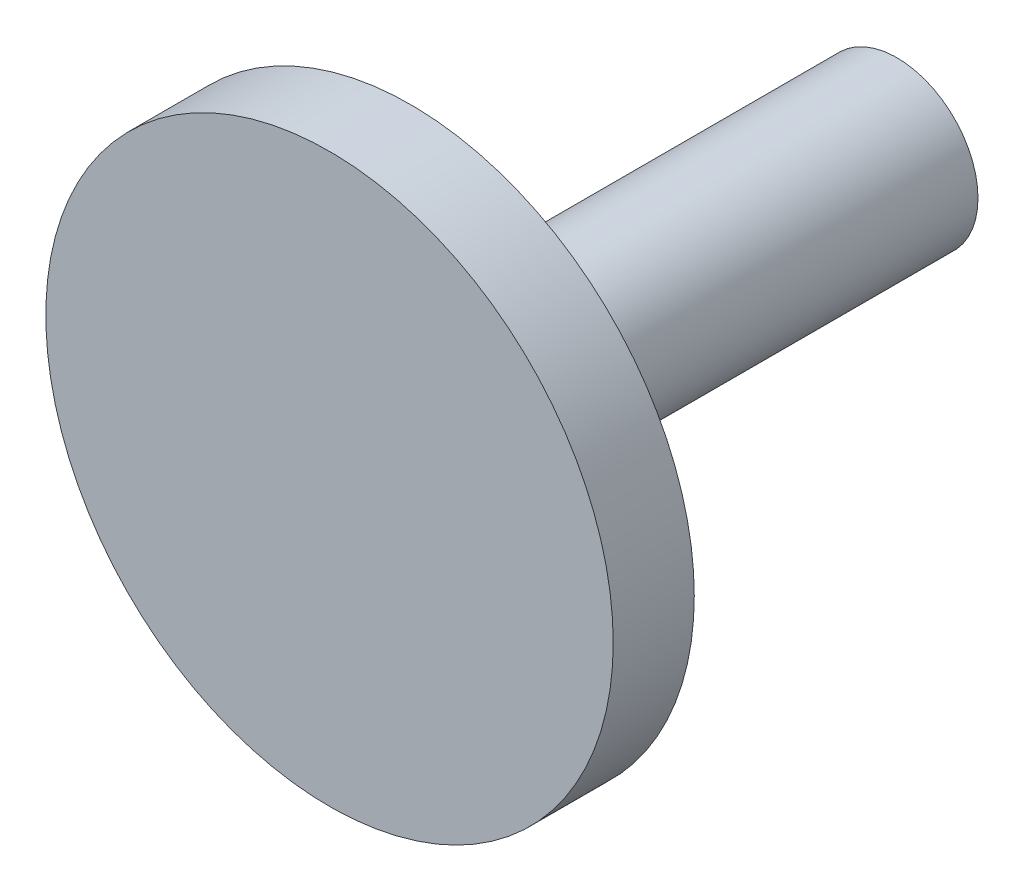
ISO-10303-21;
HEADER;
FILE_DESCRIPTION(('STEP AP214'),'2;1');
FILE_NAME('part.step','',(''),(''),'','','');
FILE_SCHEMA(('AUTOMOTIVE_DESIGN { 1 0 10303 214 1 1 1 1 }'));
ENDSEC;
DATA;
#1=APPLICATION_CONTEXT('core data for automotive mechanical design processes');
#2=APPLICATION_PROTOCOL_DEFINITION('international standard','automotive_design',2000,#1);
#3=PRODUCT_CONTEXT('',#1,'mechanical');
#4=PRODUCT('Part','Part','',(#3));
#5=PRODUCT_RELATED_PRODUCT_CATEGORY('part','',(#4));
#6=PRODUCT_DEFINITION_FORMATION('','',#4);
#7=PRODUCT_DEFINITION_CONTEXT('part definition',#1,'design');
#8=PRODUCT_DEFINITION('design','',#6,#7);
#9=PRODUCT_DEFINITION_SHAPE('','',#8);
#10=(LENGTH_UNIT() NAMED_UNIT(*) SI_UNIT(.MILLI.,.METRE.));
#11=(NAMED_UNIT(*) PLANE_ANGLE_UNIT() SI_UNIT($,.RADIAN.));
#12=(NAMED_UNIT(*) SI_UNIT($,.STERADIAN.) SOLID_ANGLE_UNIT());
#13=UNCERTAINTY_MEASURE_WITH_UNIT(LENGTH_MEASURE(1.E-05),#10,'distance_accuracy_value','');
#14=(GEOMETRIC_REPRESENTATION_CONTEXT(3) GLOBAL_UNCERTAINTY_ASSIGNED_CONTEXT((#13)) GLOBAL_UNIT_ASSIGNED_CONTEXT((#10,
#11,#12)) REPRESENTATION_CONTEXT('',''));
#15=CARTESIAN_POINT('',(0.,0.,0.));
#16=DIRECTION('',(0.,0.,1.));
#17=DIRECTION('',(1.,0.,0.));
#18=AXIS2_PLACEMENT_3D('',#15,#16,#17);
#19=CARTESIAN_POINT('',(0.,0.,5.));
#20=DIRECTION('',(0.,0.,-1.));
#21=DIRECTION('',(-1.,0.,0.));
#22=AXIS2_PLACEMENT_3D('',#19,#20,#21);
#23=CYLINDRICAL_SURFACE('',#22,17.5);
#24=CARTESIAN_POINT('',(0.,0.,5.));
#25=DIRECTION('',(0.,0.,1.));
#26=DIRECTION('',(1.,0.,0.));
#27=AXIS2_PLACEMENT_3D('',#24,#25,#26);
#28=CIRCLE('',#27,17.5);
#29=CARTESIAN_POINT('',(17.5,0.,5.));
#30=VERTEX_POINT('',#29);
#31=EDGE_CURVE('E10',#30,#30,#28,.T.);
#32=ORIENTED_EDGE('',*,*,#31,.F.);
#33=EDGE_LOOP('',(#32));
#34=FACE_BOUND('',#33,.T.);
#35=CARTESIAN_POINT('',(0.,0.,0.));
#36=DIRECTION('',(0.,0.,1.));
#37=DIRECTION('',(1.,0.,0.));
#38=AXIS2_PLACEMENT_3D('',#35,#36,#37);
#39=CIRCLE('',#38,17.5);
#40=CARTESIAN_POINT('',(17.5,0.,0.));
#41=VERTEX_POINT('',#40);
#42=EDGE_CURVE('E34',#41,#41,#39,.T.);
#43=ORIENTED_EDGE('',*,*,#42,.T.);
#44=EDGE_LOOP('',(#43));
#45=FACE_BOUND('',#44,.T.);
#46=ADVANCED_FACE('F31',(#34,#45),#23,.T.);
#47=CARTESIAN_POINT('',(0.,0.,5.));
#48=DIRECTION('',(0.,0.,1.));
#49=DIRECTION('',(1.,0.,0.));
#50=AXIS2_PLACEMENT_3D('',#47,#48,#49);
#51=PLANE('',#50);
#52=ORIENTED_EDGE('',*,*,#31,.T.);
#53=EDGE_LOOP('',(#52));
#54=FACE_BOUND('',#53,.T.);
#55=ADVANCED_FACE('F61',(#54),#51,.T.);
#56=CARTESIAN_POINT('',(0.,0.,0.));
#57=DIRECTION('',(0.,0.,1.));
#58=DIRECTION('',(1.,0.,0.));
#59=AXIS2_PLACEMENT_3D('',#56,#57,#58);
#60=PLANE('',#59);
#61=CARTESIAN_POINT('',(0.,0.,0.));
#62=DIRECTION('',(0.,0.,1.));
#63=DIRECTION('',(1.,0.,0.));
#64=AXIS2_PLACEMENT_3D('',#61,#62,#63);
#65=CIRCLE('',#64,5.);
#66=CARTESIAN_POINT('',(5.,0.,0.));
#67=VERTEX_POINT('',#66);
#68=EDGE_CURVE('E43',#67,#67,#65,.T.);
#69=ORIENTED_EDGE('',*,*,#68,.T.);
#70=EDGE_LOOP('',(#69));
#71=FACE_BOUND('',#70,.T.);
#72=ORIENTED_EDGE('',*,*,#42,.F.);
#73=EDGE_LOOP('',(#72));
#74=FACE_BOUND('',#73,.T.);
#75=ADVANCED_FACE('F58',(#71,#74),#60,.F.);
#76=CARTESIAN_POINT('',(0.,0.,-30.));
#77=DIRECTION('',(0.,0.,1.));
#78=DIRECTION('',(1.,0.,0.));
#79=AXIS2_PLACEMENT_3D('',#76,#77,#78);
#80=CYLINDRICAL_SURFACE('',#79,5.);
#81=CARTESIAN_POINT('',(0.,0.,-30.));
#82=DIRECTION('',(0.,0.,1.));
#83=DIRECTION('',(1.,0.,0.));
#84=AXIS2_PLACEMENT_3D('',#81,#82,#83);
#85=CIRCLE('',#84,5.);
#86=CARTESIAN_POINT('',(5.,0.,-30.));
#87=VERTEX_POINT('',#86);
#88=EDGE_CURVE('E41',#87,#87,#85,.T.);
#89=ORIENTED_EDGE('',*,*,#88,.T.);
#90=EDGE_LOOP('',(#89));
#91=FACE_BOUND('',#90,.T.);
#92=ORIENTED_EDGE('',*,*,#68,.F.);
#93=EDGE_LOOP('',(#92));
#94=FACE_BOUND('',#93,.T.);
#95=ADVANCED_FACE('F49',(#91,#94),#80,.T.);
#96=CARTESIAN_POINT('',(0.,0.,-30.));
#97=DIRECTION('',(0.,0.,1.));
#98=DIRECTION('',(1.,0.,0.));
#99=AXIS2_PLACEMENT_3D('',#96,#97,#98);
#100=PLANE('',#99);
#101=ORIENTED_EDGE('',*,*,#88,.F.);
#102=EDGE_LOOP('',(#101));
#103=FACE_BOUND('',#102,.T.);
#104=ADVANCED_FACE('F52',(#103),#100,.F.);
#105=CLOSED_SHELL('',(#46,#55,#75,#95,#104));
#106=MANIFOLD_SOLID_BREP('B2',#105);
#107=ADVANCED_BREP_SHAPE_REPRESENTATION('',(#18,#106),#14);
#108=SHAPE_DEFINITION_REPRESENTATION(#9,#107);
ENDSEC;
END-ISO-10303-21;
